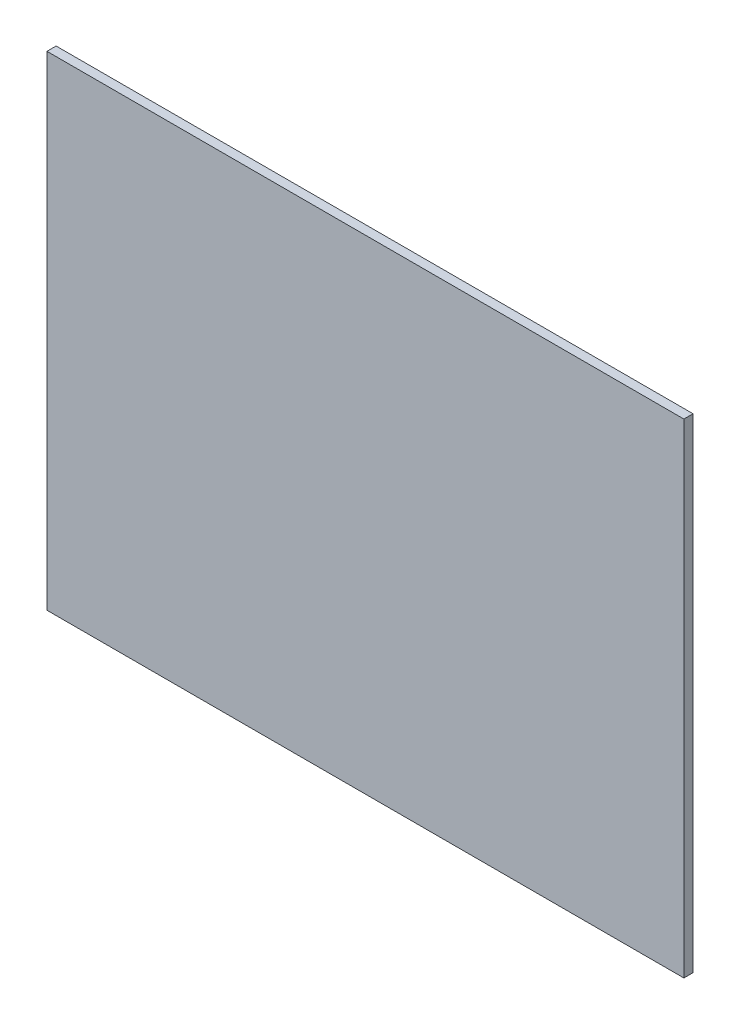
ISO-10303-21;
HEADER;
FILE_DESCRIPTION(('STEP AP214'),'2;1');
FILE_NAME('part.step','',(''),(''),'','','');
FILE_SCHEMA(('AUTOMOTIVE_DESIGN { 1 0 10303 214 1 1 1 1 }'));
ENDSEC;
DATA;
#1=APPLICATION_CONTEXT('core data for automotive mechanical design processes');
#2=APPLICATION_PROTOCOL_DEFINITION('international standard','automotive_design',2000,#1);
#3=PRODUCT_CONTEXT('',#1,'mechanical');
#4=PRODUCT('Part','Part','',(#3));
#5=PRODUCT_RELATED_PRODUCT_CATEGORY('part','',(#4));
#6=PRODUCT_DEFINITION_FORMATION('','',#4);
#7=PRODUCT_DEFINITION_CONTEXT('part definition',#1,'design');
#8=PRODUCT_DEFINITION('design','',#6,#7);
#9=PRODUCT_DEFINITION_SHAPE('','',#8);
#10=(LENGTH_UNIT() NAMED_UNIT(*) SI_UNIT(.MILLI.,.METRE.));
#11=(NAMED_UNIT(*) PLANE_ANGLE_UNIT() SI_UNIT($,.RADIAN.));
#12=(NAMED_UNIT(*) SI_UNIT($,.STERADIAN.) SOLID_ANGLE_UNIT());
#13=UNCERTAINTY_MEASURE_WITH_UNIT(LENGTH_MEASURE(1.E-05),#10,'distance_accuracy_value','');
#14=(GEOMETRIC_REPRESENTATION_CONTEXT(3) GLOBAL_UNCERTAINTY_ASSIGNED_CONTEXT((#13)) GLOBAL_UNIT_ASSIGNED_CONTEXT((#10,
#11,#12)) REPRESENTATION_CONTEXT('',''));
#15=CARTESIAN_POINT('',(0.,0.,0.));
#16=DIRECTION('',(0.,0.,1.));
#17=DIRECTION('',(1.,0.,0.));
#18=AXIS2_PLACEMENT_3D('',#15,#16,#17);
#19=CARTESIAN_POINT('',(0.,-3.6,3.74));
#20=DIRECTION('',(0.,0.,1.));
#21=DIRECTION('',(0.,-1.,0.));
#22=AXIS2_PLACEMENT_3D('',#19,#20,#21);
#23=PLANE('',#22);
#24=DIRECTION('',(0.,-1.,0.));
#25=VECTOR('',#24,1.);
#26=CARTESIAN_POINT('',(-6.25,1.15,3.74));
#27=LINE('',#26,#25);
#28=CARTESIAN_POINT('',(-6.25,1.15,3.74));
#29=VERTEX_POINT('',#28);
#30=CARTESIAN_POINT('',(-6.25,-8.35,3.74));
#31=VERTEX_POINT('',#30);
#32=EDGE_CURVE('E82',#29,#31,#27,.T.);
#33=ORIENTED_EDGE('',*,*,#32,.T.);
#34=DIRECTION('',(1.,0.,0.));
#35=VECTOR('',#34,1.);
#36=CARTESIAN_POINT('',(-6.25,-8.35,3.74));
#37=LINE('',#36,#35);
#38=CARTESIAN_POINT('',(6.25,-8.35,3.74));
#39=VERTEX_POINT('',#38);
#40=EDGE_CURVE('E97',#31,#39,#37,.T.);
#41=ORIENTED_EDGE('',*,*,#40,.T.);
#42=DIRECTION('',(0.,1.,0.));
#43=VECTOR('',#42,1.);
#44=CARTESIAN_POINT('',(6.25,-8.35,3.74));
#45=LINE('',#44,#43);
#46=CARTESIAN_POINT('',(6.25,1.15,3.74));
#47=VERTEX_POINT('',#46);
#48=EDGE_CURVE('E75',#39,#47,#45,.T.);
#49=ORIENTED_EDGE('',*,*,#48,.T.);
#50=DIRECTION('',(-1.,0.,0.));
#51=VECTOR('',#50,1.);
#52=CARTESIAN_POINT('',(6.25,1.15,3.74));
#53=LINE('',#52,#51);
#54=EDGE_CURVE('E11',#47,#29,#53,.T.);
#55=ORIENTED_EDGE('',*,*,#54,.T.);
#56=EDGE_LOOP('',(#33,#41,#49,#55));
#57=FACE_BOUND('',#56,.T.);
#58=ADVANCED_FACE('F17',(#57),#23,.T.);
#59=CARTESIAN_POINT('',(0.,-3.6,3.56));
#60=DIRECTION('',(0.,0.,1.));
#61=DIRECTION('',(0.,-1.,0.));
#62=AXIS2_PLACEMENT_3D('',#59,#60,#61);
#63=PLANE('',#62);
#64=DIRECTION('',(0.,-1.,0.));
#65=VECTOR('',#64,1.);
#66=CARTESIAN_POINT('',(-6.25,1.15,3.56));
#67=LINE('',#66,#65);
#68=CARTESIAN_POINT('',(-6.25,1.15,3.56));
#69=VERTEX_POINT('',#68);
#70=CARTESIAN_POINT('',(-6.25,-8.35,3.56));
#71=VERTEX_POINT('',#70);
#72=EDGE_CURVE('E80',#69,#71,#67,.T.);
#73=ORIENTED_EDGE('',*,*,#72,.F.);
#74=DIRECTION('',(-1.,0.,0.));
#75=VECTOR('',#74,1.);
#76=CARTESIAN_POINT('',(6.25,1.15,3.56));
#77=LINE('',#76,#75);
#78=CARTESIAN_POINT('',(6.25,1.15,3.56));
#79=VERTEX_POINT('',#78);
#80=EDGE_CURVE('E26',#79,#69,#77,.T.);
#81=ORIENTED_EDGE('',*,*,#80,.F.);
#82=DIRECTION('',(0.,1.,0.));
#83=VECTOR('',#82,1.);
#84=CARTESIAN_POINT('',(6.25,-8.35,3.56));
#85=LINE('',#84,#83);
#86=CARTESIAN_POINT('',(6.25,-8.35,3.56));
#87=VERTEX_POINT('',#86);
#88=EDGE_CURVE('E101',#87,#79,#85,.T.);
#89=ORIENTED_EDGE('',*,*,#88,.F.);
#90=DIRECTION('',(1.,0.,0.));
#91=VECTOR('',#90,1.);
#92=CARTESIAN_POINT('',(-6.25,-8.35,3.56));
#93=LINE('',#92,#91);
#94=EDGE_CURVE('E84',#71,#87,#93,.T.);
#95=ORIENTED_EDGE('',*,*,#94,.F.);
#96=EDGE_LOOP('',(#73,#81,#89,#95));
#97=FACE_BOUND('',#96,.T.);
#98=ADVANCED_FACE('F19',(#97),#63,.F.);
#99=CARTESIAN_POINT('',(6.25,1.15,3.74));
#100=DIRECTION('',(0.,-1.,0.));
#101=DIRECTION('',(0.,0.,-1.));
#102=AXIS2_PLACEMENT_3D('',#99,#100,#101);
#103=PLANE('',#102);
#104=ORIENTED_EDGE('',*,*,#80,.T.);
#105=DIRECTION('',(0.,0.,-1.));
#106=VECTOR('',#105,1.);
#107=CARTESIAN_POINT('',(-6.25,1.15,3.74));
#108=LINE('',#107,#106);
#109=EDGE_CURVE('E69',#29,#69,#108,.T.);
#110=ORIENTED_EDGE('',*,*,#109,.F.);
#111=ORIENTED_EDGE('',*,*,#54,.F.);
#112=DIRECTION('',(0.,0.,-1.));
#113=VECTOR('',#112,1.);
#114=CARTESIAN_POINT('',(6.25,1.15,3.74));
#115=LINE('',#114,#113);
#116=EDGE_CURVE('E72',#47,#79,#115,.T.);
#117=ORIENTED_EDGE('',*,*,#116,.T.);
#118=EDGE_LOOP('',(#104,#110,#111,#117));
#119=FACE_BOUND('',#118,.T.);
#120=ADVANCED_FACE('F68',(#119),#103,.F.);
#121=CARTESIAN_POINT('',(6.25,-8.35,3.74));
#122=DIRECTION('',(-1.,0.,0.));
#123=DIRECTION('',(0.,1.,0.));
#124=AXIS2_PLACEMENT_3D('',#121,#122,#123);
#125=PLANE('',#124);
#126=ORIENTED_EDGE('',*,*,#88,.T.);
#127=ORIENTED_EDGE('',*,*,#116,.F.);
#128=ORIENTED_EDGE('',*,*,#48,.F.);
#129=DIRECTION('',(0.,0.,-1.));
#130=VECTOR('',#129,1.);
#131=CARTESIAN_POINT('',(6.25,-8.35,3.74));
#132=LINE('',#131,#130);
#133=EDGE_CURVE('E102',#39,#87,#132,.T.);
#134=ORIENTED_EDGE('',*,*,#133,.T.);
#135=EDGE_LOOP('',(#126,#127,#128,#134));
#136=FACE_BOUND('',#135,.T.);
#137=ADVANCED_FACE('F117',(#136),#125,.F.);
#138=CARTESIAN_POINT('',(-6.25,-8.35,3.74));
#139=DIRECTION('',(0.,1.,0.));
#140=DIRECTION('',(0.,0.,-1.));
#141=AXIS2_PLACEMENT_3D('',#138,#139,#140);
#142=PLANE('',#141);
#143=ORIENTED_EDGE('',*,*,#94,.T.);
#144=ORIENTED_EDGE('',*,*,#133,.F.);
#145=ORIENTED_EDGE('',*,*,#40,.F.);
#146=DIRECTION('',(0.,0.,-1.));
#147=VECTOR('',#146,1.);
#148=CARTESIAN_POINT('',(-6.25,-8.35,3.74));
#149=LINE('',#148,#147);
#150=EDGE_CURVE('E89',#31,#71,#149,.T.);
#151=ORIENTED_EDGE('',*,*,#150,.T.);
#152=EDGE_LOOP('',(#143,#144,#145,#151));
#153=FACE_BOUND('',#152,.T.);
#154=ADVANCED_FACE('F119',(#153),#142,.F.);
#155=CARTESIAN_POINT('',(-6.25,1.15,3.74));
#156=DIRECTION('',(1.,0.,0.));
#157=DIRECTION('',(0.,0.,-1.));
#158=AXIS2_PLACEMENT_3D('',#155,#156,#157);
#159=PLANE('',#158);
#160=ORIENTED_EDGE('',*,*,#72,.T.);
#161=ORIENTED_EDGE('',*,*,#150,.F.);
#162=ORIENTED_EDGE('',*,*,#32,.F.);
#163=ORIENTED_EDGE('',*,*,#109,.T.);
#164=EDGE_LOOP('',(#160,#161,#162,#163));
#165=FACE_BOUND('',#164,.T.);
#166=ADVANCED_FACE('F78',(#165),#159,.F.);
#167=CLOSED_SHELL('',(#58,#98,#120,#137,#154,#166));
#168=MANIFOLD_SOLID_BREP('B1',#167);
#169=ADVANCED_BREP_SHAPE_REPRESENTATION('',(#18,#168),#14);
#170=SHAPE_DEFINITION_REPRESENTATION(#9,#169);
ENDSEC;
END-ISO-10303-21;
